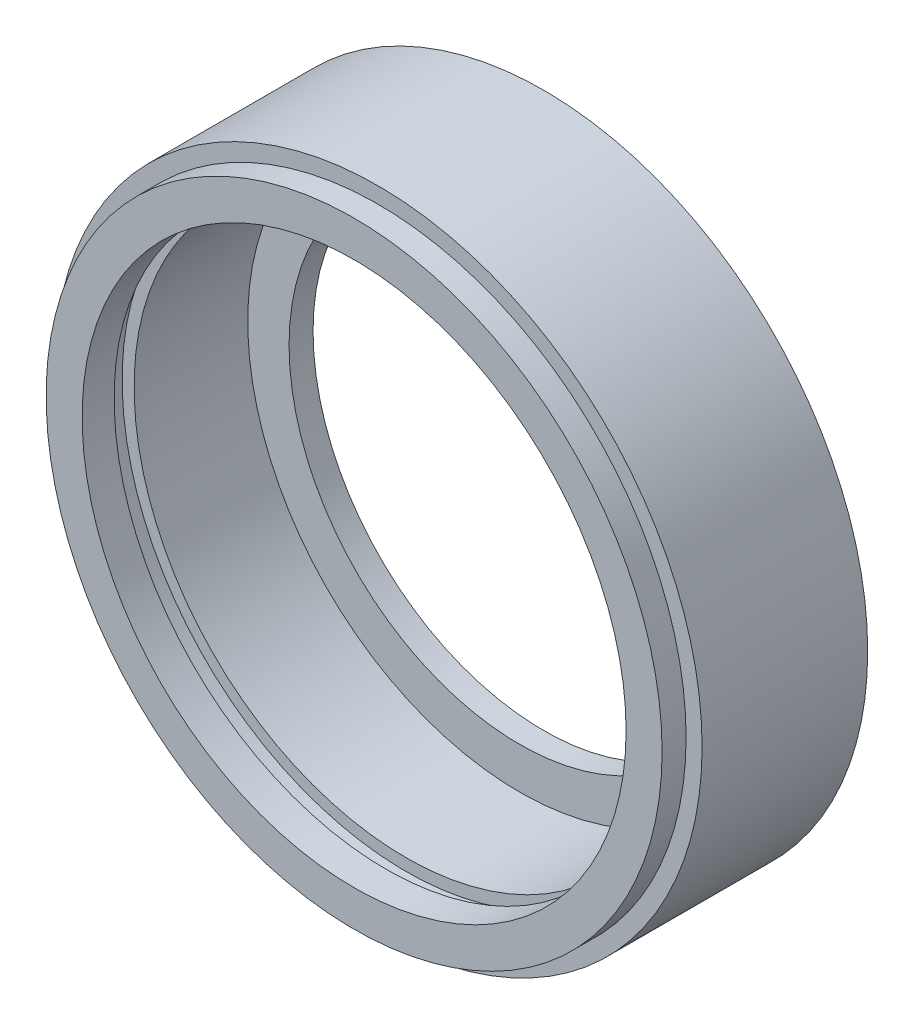
ISO-10303-21;
HEADER;
FILE_DESCRIPTION(('STEP AP214'),'2;1');
FILE_NAME('part.step','',(''),(''),'','','');
FILE_SCHEMA(('AUTOMOTIVE_DESIGN { 1 0 10303 214 1 1 1 1 }'));
ENDSEC;
DATA;
#1=APPLICATION_CONTEXT('core data for automotive mechanical design processes');
#2=APPLICATION_PROTOCOL_DEFINITION('international standard','automotive_design',2000,#1);
#3=PRODUCT_CONTEXT('',#1,'mechanical');
#4=PRODUCT('Part','Part','',(#3));
#5=PRODUCT_RELATED_PRODUCT_CATEGORY('part','',(#4));
#6=PRODUCT_DEFINITION_FORMATION('','',#4);
#7=PRODUCT_DEFINITION_CONTEXT('part definition',#1,'design');
#8=PRODUCT_DEFINITION('design','',#6,#7);
#9=PRODUCT_DEFINITION_SHAPE('','',#8);
#10=(LENGTH_UNIT() NAMED_UNIT(*) SI_UNIT(.MILLI.,.METRE.));
#11=(NAMED_UNIT(*) PLANE_ANGLE_UNIT() SI_UNIT($,.RADIAN.));
#12=(NAMED_UNIT(*) SI_UNIT($,.STERADIAN.) SOLID_ANGLE_UNIT());
#13=UNCERTAINTY_MEASURE_WITH_UNIT(LENGTH_MEASURE(1.E-05),#10,'distance_accuracy_value','');
#14=(GEOMETRIC_REPRESENTATION_CONTEXT(3) GLOBAL_UNCERTAINTY_ASSIGNED_CONTEXT((#13)) GLOBAL_UNIT_ASSIGNED_CONTEXT((#10,
#11,#12)) REPRESENTATION_CONTEXT('',''));
#15=CARTESIAN_POINT('',(0.,0.,0.));
#16=DIRECTION('',(0.,0.,1.));
#17=DIRECTION('',(1.,0.,0.));
#18=AXIS2_PLACEMENT_3D('',#15,#16,#17);
#19=CARTESIAN_POINT('',(2.22044604925031E-13,4.44089209850063E-13,1010.5));
#20=DIRECTION('',(0.,0.,1.));
#21=DIRECTION('',(1.,0.,0.));
#22=AXIS2_PLACEMENT_3D('',#19,#20,#21);
#23=CYLINDRICAL_SURFACE('',#22,40.5);
#24=CARTESIAN_POINT('',(-1.11022302462516E-13,4.44089209850063E-13,20.7000000000001));
#25=DIRECTION('',(0.,0.,1.));
#26=DIRECTION('',(1.,0.,0.));
#27=AXIS2_PLACEMENT_3D('',#24,#25,#26);
#28=CIRCLE('',#27,40.5);
#29=CARTESIAN_POINT('',(40.5,5.03736809209787E-13,20.7000000000001));
#30=VERTEX_POINT('',#29);
#31=EDGE_CURVE('E12',#30,#30,#28,.T.);
#32=ORIENTED_EDGE('',*,*,#31,.F.);
#33=EDGE_LOOP('',(#32));
#34=FACE_BOUND('',#33,.T.);
#35=CARTESIAN_POINT('',(0.,0.,0.));
#36=DIRECTION('',(0.,0.,1.));
#37=DIRECTION('',(1.,0.,0.));
#38=AXIS2_PLACEMENT_3D('',#35,#36,#37);
#39=CIRCLE('',#38,40.5);
#40=CARTESIAN_POINT('',(40.5000000000001,0.,0.));
#41=VERTEX_POINT('',#40);
#42=EDGE_CURVE('E99',#41,#41,#39,.T.);
#43=ORIENTED_EDGE('',*,*,#42,.T.);
#44=EDGE_LOOP('',(#43));
#45=FACE_BOUND('',#44,.T.);
#46=ADVANCED_FACE('F46',(#34,#45),#23,.T.);
#47=CARTESIAN_POINT('',(3.33066907387547E-13,38.5000000000009,20.7000000000001));
#48=DIRECTION('',(0.,0.,-1.));
#49=DIRECTION('',(-1.,0.,0.));
#50=AXIS2_PLACEMENT_3D('',#47,#48,#49);
#51=PLANE('',#50);
#52=CARTESIAN_POINT('',(-1.11022302462516E-13,4.44089209850063E-13,20.7000000000001));
#53=DIRECTION('',(0.,0.,1.));
#54=DIRECTION('',(1.,0.,0.));
#55=AXIS2_PLACEMENT_3D('',#52,#53,#54);
#56=CIRCLE('',#55,38.5);
#57=CARTESIAN_POINT('',(38.5,5.00791248747579E-13,20.7000000000001));
#58=VERTEX_POINT('',#57);
#59=EDGE_CURVE('E53',#58,#58,#56,.T.);
#60=ORIENTED_EDGE('',*,*,#59,.F.);
#61=EDGE_LOOP('',(#60));
#62=FACE_BOUND('',#61,.T.);
#63=ORIENTED_EDGE('',*,*,#31,.T.);
#64=EDGE_LOOP('',(#63));
#65=FACE_BOUND('',#64,.T.);
#66=ADVANCED_FACE('F162',(#62,#65),#51,.F.);
#67=CARTESIAN_POINT('',(2.22044604925031E-13,4.44089209850063E-13,1010.5));
#68=DIRECTION('',(0.,0.,1.));
#69=DIRECTION('',(1.,0.,0.));
#70=AXIS2_PLACEMENT_3D('',#67,#68,#69);
#71=CYLINDRICAL_SURFACE('',#70,38.5);
#72=CARTESIAN_POINT('',(-1.11022302462516E-13,4.44089209850063E-13,23.7000000000001));
#73=DIRECTION('',(0.,0.,1.));
#74=DIRECTION('',(1.,0.,0.));
#75=AXIS2_PLACEMENT_3D('',#72,#73,#74);
#76=CIRCLE('',#75,38.5);
#77=CARTESIAN_POINT('',(38.5,5.00791248747579E-13,23.7000000000001));
#78=VERTEX_POINT('',#77);
#79=EDGE_CURVE('E59',#78,#78,#76,.T.);
#80=ORIENTED_EDGE('',*,*,#79,.F.);
#81=EDGE_LOOP('',(#80));
#82=FACE_BOUND('',#81,.T.);
#83=ORIENTED_EDGE('',*,*,#59,.T.);
#84=EDGE_LOOP('',(#83));
#85=FACE_BOUND('',#84,.T.);
#86=ADVANCED_FACE('F157',(#82,#85),#71,.T.);
#87=CARTESIAN_POINT('',(6.66133814775094E-13,34.0000000000007,23.6999999999999));
#88=DIRECTION('',(0.,0.,-1.));
#89=DIRECTION('',(-1.,0.,0.));
#90=AXIS2_PLACEMENT_3D('',#87,#88,#89);
#91=PLANE('',#90);
#92=CARTESIAN_POINT('',(-1.11022302462516E-13,4.44089209850063E-13,23.7000000000001));
#93=DIRECTION('',(0.,0.,1.));
#94=DIRECTION('',(1.,0.,0.));
#95=AXIS2_PLACEMENT_3D('',#92,#93,#94);
#96=CIRCLE('',#95,34.);
#97=CARTESIAN_POINT('',(34.,4.94163737707609E-13,23.7000000000001));
#98=VERTEX_POINT('',#97);
#99=EDGE_CURVE('E65',#98,#98,#96,.T.);
#100=ORIENTED_EDGE('',*,*,#99,.F.);
#101=EDGE_LOOP('',(#100));
#102=FACE_BOUND('',#101,.T.);
#103=ORIENTED_EDGE('',*,*,#79,.T.);
#104=EDGE_LOOP('',(#103));
#105=FACE_BOUND('',#104,.T.);
#106=ADVANCED_FACE('F151',(#102,#105),#91,.F.);
#107=CARTESIAN_POINT('',(2.22044604925031E-13,4.44089209850063E-13,1010.5));
#108=DIRECTION('',(0.,0.,1.));
#109=DIRECTION('',(1.,0.,0.));
#110=AXIS2_PLACEMENT_3D('',#107,#108,#109);
#111=CYLINDRICAL_SURFACE('',#110,34.);
#112=CARTESIAN_POINT('',(-1.11022302462516E-13,4.44089209850063E-13,19.7000000000001));
#113=DIRECTION('',(0.,0.,1.));
#114=DIRECTION('',(1.,0.,0.));
#115=AXIS2_PLACEMENT_3D('',#112,#113,#114);
#116=CIRCLE('',#115,34.);
#117=CARTESIAN_POINT('',(34.,4.94163737707609E-13,19.7000000000001));
#118=VERTEX_POINT('',#117);
#119=EDGE_CURVE('E71',#118,#118,#116,.T.);
#120=ORIENTED_EDGE('',*,*,#119,.F.);
#121=EDGE_LOOP('',(#120));
#122=FACE_BOUND('',#121,.T.);
#123=ORIENTED_EDGE('',*,*,#99,.T.);
#124=EDGE_LOOP('',(#123));
#125=FACE_BOUND('',#124,.T.);
#126=ADVANCED_FACE('F145',(#122,#125),#111,.F.);
#127=CARTESIAN_POINT('',(5.55111512312578E-13,35.5000000000008,19.6999999999999));
#128=DIRECTION('',(0.,0.,1.));
#129=DIRECTION('',(1.,0.,0.));
#130=AXIS2_PLACEMENT_3D('',#127,#128,#129);
#131=PLANE('',#130);
#132=CARTESIAN_POINT('',(-1.11022302462516E-13,4.44089209850063E-13,19.7000000000001));
#133=DIRECTION('',(0.,0.,1.));
#134=DIRECTION('',(1.,0.,0.));
#135=AXIS2_PLACEMENT_3D('',#132,#133,#134);
#136=CIRCLE('',#135,35.5);
#137=CARTESIAN_POINT('',(35.5,4.96372908054266E-13,19.7000000000001));
#138=VERTEX_POINT('',#137);
#139=EDGE_CURVE('E75',#138,#138,#136,.T.);
#140=ORIENTED_EDGE('',*,*,#139,.F.);
#141=EDGE_LOOP('',(#140));
#142=FACE_BOUND('',#141,.T.);
#143=ORIENTED_EDGE('',*,*,#119,.T.);
#144=EDGE_LOOP('',(#143));
#145=FACE_BOUND('',#144,.T.);
#146=ADVANCED_FACE('F139',(#142,#145),#131,.F.);
#147=CARTESIAN_POINT('',(2.22044604925031E-13,4.44089209850063E-13,1010.5));
#148=DIRECTION('',(0.,0.,1.));
#149=DIRECTION('',(1.,0.,0.));
#150=AXIS2_PLACEMENT_3D('',#147,#148,#149);
#151=CYLINDRICAL_SURFACE('',#150,35.5);
#152=CARTESIAN_POINT('',(-3.33066907387547E-13,4.44089209850063E-13,17.2000000000001));
#153=DIRECTION('',(0.,0.,1.));
#154=DIRECTION('',(1.,0.,0.));
#155=AXIS2_PLACEMENT_3D('',#152,#153,#154);
#156=CIRCLE('',#155,35.5);
#157=CARTESIAN_POINT('',(35.4999999999997,4.96372908054266E-13,17.2000000000001));
#158=VERTEX_POINT('',#157);
#159=EDGE_CURVE('E79',#158,#158,#156,.T.);
#160=ORIENTED_EDGE('',*,*,#159,.F.);
#161=EDGE_LOOP('',(#160));
#162=FACE_BOUND('',#161,.T.);
#163=ORIENTED_EDGE('',*,*,#139,.T.);
#164=EDGE_LOOP('',(#163));
#165=FACE_BOUND('',#164,.T.);
#166=ADVANCED_FACE('F133',(#162,#165),#151,.F.);
#167=CARTESIAN_POINT('',(3.33066907387547E-13,35.5000000000008,17.2));
#168=DIRECTION('',(0.,0.,-1.));
#169=DIRECTION('',(-1.,0.,0.));
#170=AXIS2_PLACEMENT_3D('',#167,#168,#169);
#171=PLANE('',#170);
#172=CARTESIAN_POINT('',(-3.33066907387547E-13,4.44089209850063E-13,17.2000000000001));
#173=DIRECTION('',(0.,0.,1.));
#174=DIRECTION('',(1.,0.,0.));
#175=AXIS2_PLACEMENT_3D('',#172,#173,#174);
#176=CIRCLE('',#175,34.);
#177=CARTESIAN_POINT('',(33.9999999999997,4.94163737707609E-13,17.2000000000001));
#178=VERTEX_POINT('',#177);
#179=EDGE_CURVE('E83',#178,#178,#176,.T.);
#180=ORIENTED_EDGE('',*,*,#179,.F.);
#181=EDGE_LOOP('',(#180));
#182=FACE_BOUND('',#181,.T.);
#183=ORIENTED_EDGE('',*,*,#159,.T.);
#184=EDGE_LOOP('',(#183));
#185=FACE_BOUND('',#184,.T.);
#186=ADVANCED_FACE('F127',(#182,#185),#171,.F.);
#187=CARTESIAN_POINT('',(2.22044604925031E-13,4.44089209850063E-13,1010.5));
#188=DIRECTION('',(0.,0.,1.));
#189=DIRECTION('',(1.,0.,0.));
#190=AXIS2_PLACEMENT_3D('',#187,#188,#189);
#191=CYLINDRICAL_SURFACE('',#190,34.);
#192=CARTESIAN_POINT('',(2.22044604925031E-13,0.,2.99999999999989));
#193=DIRECTION('',(0.,0.,1.));
#194=DIRECTION('',(1.,0.,0.));
#195=AXIS2_PLACEMENT_3D('',#192,#193,#194);
#196=CIRCLE('',#195,34.);
#197=CARTESIAN_POINT('',(34.0000000000003,0.,2.99999999999989));
#198=VERTEX_POINT('',#197);
#199=EDGE_CURVE('E87',#198,#198,#196,.T.);
#200=ORIENTED_EDGE('',*,*,#199,.F.);
#201=EDGE_LOOP('',(#200));
#202=FACE_BOUND('',#201,.T.);
#203=ORIENTED_EDGE('',*,*,#179,.T.);
#204=EDGE_LOOP('',(#203));
#205=FACE_BOUND('',#204,.T.);
#206=ADVANCED_FACE('F121',(#202,#205),#191,.F.);
#207=CARTESIAN_POINT('',(7.7715611723761E-13,34.0000000000007,2.99999999999978));
#208=DIRECTION('',(0.,0.,-1.));
#209=DIRECTION('',(-1.,0.,0.));
#210=AXIS2_PLACEMENT_3D('',#207,#208,#209);
#211=PLANE('',#210);
#212=CARTESIAN_POINT('',(2.22044604925031E-13,0.,2.99999999999989));
#213=DIRECTION('',(0.,0.,1.));
#214=DIRECTION('',(1.,0.,0.));
#215=AXIS2_PLACEMENT_3D('',#212,#213,#214);
#216=CIRCLE('',#215,28.8333333333333);
#217=CARTESIAN_POINT('',(28.8333333333336,0.,2.99999999999989));
#218=VERTEX_POINT('',#217);
#219=EDGE_CURVE('E91',#218,#218,#216,.T.);
#220=ORIENTED_EDGE('',*,*,#219,.F.);
#221=EDGE_LOOP('',(#220));
#222=FACE_BOUND('',#221,.T.);
#223=ORIENTED_EDGE('',*,*,#199,.T.);
#224=EDGE_LOOP('',(#223));
#225=FACE_BOUND('',#224,.T.);
#226=ADVANCED_FACE('F115',(#222,#225),#211,.F.);
#227=CARTESIAN_POINT('',(2.22044604925031E-13,4.44089209850063E-13,1010.5));
#228=DIRECTION('',(0.,0.,1.));
#229=DIRECTION('',(1.,0.,0.));
#230=AXIS2_PLACEMENT_3D('',#227,#228,#229);
#231=CYLINDRICAL_SURFACE('',#230,28.8333333333333);
#232=CARTESIAN_POINT('',(0.,0.,0.));
#233=DIRECTION('',(0.,0.,1.));
#234=DIRECTION('',(1.,0.,0.));
#235=AXIS2_PLACEMENT_3D('',#232,#233,#234);
#236=CIRCLE('',#235,28.8333333333333);
#237=CARTESIAN_POINT('',(28.8333333333334,0.,0.));
#238=VERTEX_POINT('',#237);
#239=EDGE_CURVE('E95',#238,#238,#236,.T.);
#240=ORIENTED_EDGE('',*,*,#239,.F.);
#241=EDGE_LOOP('',(#240));
#242=FACE_BOUND('',#241,.T.);
#243=ORIENTED_EDGE('',*,*,#219,.T.);
#244=EDGE_LOOP('',(#243));
#245=FACE_BOUND('',#244,.T.);
#246=ADVANCED_FACE('F109',(#242,#245),#231,.F.);
#247=CARTESIAN_POINT('',(5.55111512312578E-13,28.8333333333335,1.11022302462516E-13));
#248=DIRECTION('',(0.,0.,1.));
#249=DIRECTION('',(1.,0.,0.));
#250=AXIS2_PLACEMENT_3D('',#247,#248,#249);
#251=PLANE('',#250);
#252=ORIENTED_EDGE('',*,*,#42,.F.);
#253=EDGE_LOOP('',(#252));
#254=FACE_BOUND('',#253,.T.);
#255=ORIENTED_EDGE('',*,*,#239,.T.);
#256=EDGE_LOOP('',(#255));
#257=FACE_BOUND('',#256,.T.);
#258=ADVANCED_FACE('F106',(#254,#257),#251,.F.);
#259=CLOSED_SHELL('',(#46,#66,#86,#106,#126,#146,#166,#186,#206,#226,#246,#258));
#260=MANIFOLD_SOLID_BREP('B2',#259);
#261=ADVANCED_BREP_SHAPE_REPRESENTATION('',(#18,#260),#14);
#262=SHAPE_DEFINITION_REPRESENTATION(#9,#261);
ENDSEC;
END-ISO-10303-21;
